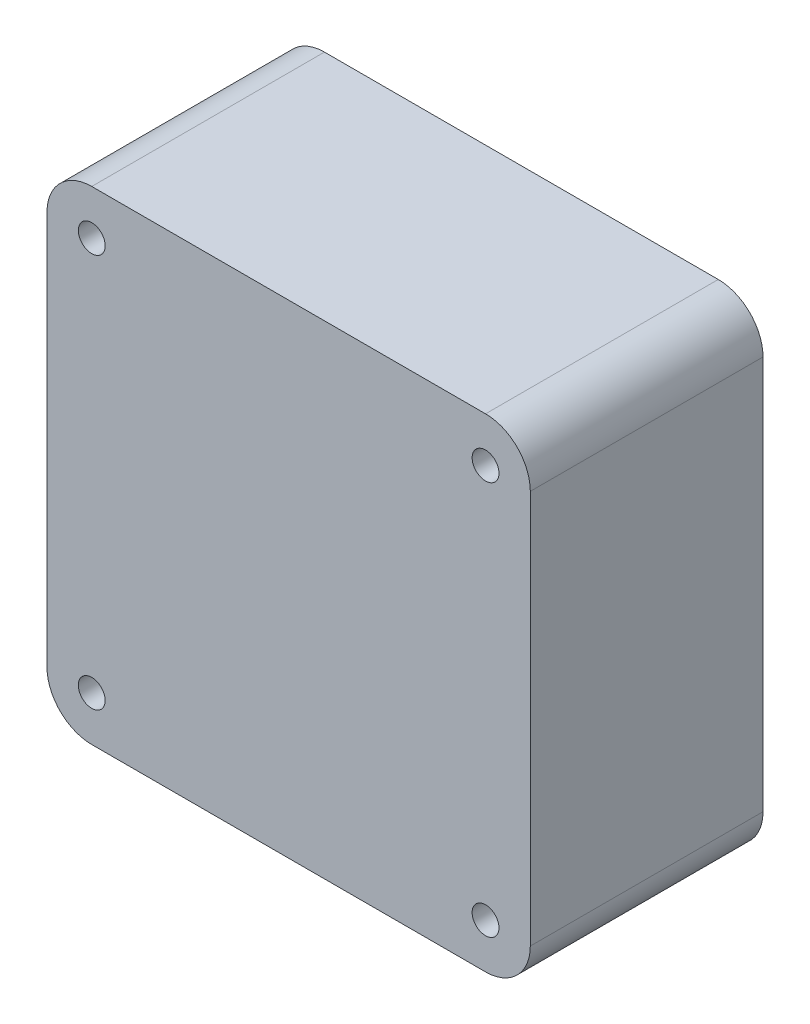
ISO-10303-21;
HEADER;
FILE_DESCRIPTION(('STEP AP214'),'2;1');
FILE_NAME('part.step','',(''),(''),'','','');
FILE_SCHEMA(('AUTOMOTIVE_DESIGN { 1 0 10303 214 1 1 1 1 }'));
ENDSEC;
DATA;
#1=APPLICATION_CONTEXT('core data for automotive mechanical design processes');
#2=APPLICATION_PROTOCOL_DEFINITION('international standard','automotive_design',2000,#1);
#3=PRODUCT_CONTEXT('',#1,'mechanical');
#4=PRODUCT('Part','Part','',(#3));
#5=PRODUCT_RELATED_PRODUCT_CATEGORY('part','',(#4));
#6=PRODUCT_DEFINITION_FORMATION('','',#4);
#7=PRODUCT_DEFINITION_CONTEXT('part definition',#1,'design');
#8=PRODUCT_DEFINITION('design','',#6,#7);
#9=PRODUCT_DEFINITION_SHAPE('','',#8);
#10=(LENGTH_UNIT() NAMED_UNIT(*) SI_UNIT(.MILLI.,.METRE.));
#11=(NAMED_UNIT(*) PLANE_ANGLE_UNIT() SI_UNIT($,.RADIAN.));
#12=(NAMED_UNIT(*) SI_UNIT($,.STERADIAN.) SOLID_ANGLE_UNIT());
#13=UNCERTAINTY_MEASURE_WITH_UNIT(LENGTH_MEASURE(1.E-05),#10,'distance_accuracy_value','');
#14=(GEOMETRIC_REPRESENTATION_CONTEXT(3) GLOBAL_UNCERTAINTY_ASSIGNED_CONTEXT((#13)) GLOBAL_UNIT_ASSIGNED_CONTEXT((#10,
#11,#12)) REPRESENTATION_CONTEXT('',''));
#15=CARTESIAN_POINT('',(0.,0.,0.));
#16=DIRECTION('',(0.,0.,1.));
#17=DIRECTION('',(1.,0.,0.));
#18=AXIS2_PLACEMENT_3D('',#15,#16,#17);
#19=CARTESIAN_POINT('',(-27.,-27.,26.));
#20=DIRECTION('',(1.,0.,0.));
#21=DIRECTION('',(0.,0.,-1.));
#22=AXIS2_PLACEMENT_3D('',#19,#20,#21);
#23=PLANE('',#22);
#24=DIRECTION('',(0.,-1.,0.));
#25=VECTOR('',#24,1.);
#26=CARTESIAN_POINT('',(-27.,-27.,0.));
#27=LINE('',#26,#25);
#28=CARTESIAN_POINT('',(-27.,22.,0.));
#29=VERTEX_POINT('',#28);
#30=CARTESIAN_POINT('',(-27.,-22.,0.));
#31=VERTEX_POINT('',#30);
#32=EDGE_CURVE('E143',#29,#31,#27,.T.);
#33=ORIENTED_EDGE('',*,*,#32,.T.);
#34=DIRECTION('',(0.,0.,-1.));
#35=VECTOR('',#34,1.);
#36=CARTESIAN_POINT('',(-27.,-22.,26.));
#37=LINE('',#36,#35);
#38=CARTESIAN_POINT('',(-27.,-22.,26.));
#39=VERTEX_POINT('',#38);
#40=EDGE_CURVE('E119',#31,#39,#37,.F.);
#41=ORIENTED_EDGE('',*,*,#40,.T.);
#42=DIRECTION('',(0.,-1.,0.));
#43=VECTOR('',#42,1.);
#44=CARTESIAN_POINT('',(-27.,-27.,26.));
#45=LINE('',#44,#43);
#46=CARTESIAN_POINT('',(-27.,22.,26.));
#47=VERTEX_POINT('',#46);
#48=EDGE_CURVE('E152',#47,#39,#45,.T.);
#49=ORIENTED_EDGE('',*,*,#48,.F.);
#50=DIRECTION('',(0.,0.,-1.));
#51=VECTOR('',#50,1.);
#52=CARTESIAN_POINT('',(-27.,22.,26.));
#53=LINE('',#52,#51);
#54=EDGE_CURVE('E124',#47,#29,#53,.T.);
#55=ORIENTED_EDGE('',*,*,#54,.T.);
#56=EDGE_LOOP('',(#33,#41,#49,#55));
#57=FACE_BOUND('',#56,.T.);
#58=ADVANCED_FACE('F42',(#57),#23,.F.);
#59=CARTESIAN_POINT('',(27.,-27.,26.));
#60=DIRECTION('',(0.,1.,0.));
#61=DIRECTION('',(0.,0.,1.));
#62=AXIS2_PLACEMENT_3D('',#59,#60,#61);
#63=PLANE('',#62);
#64=DIRECTION('',(1.,0.,0.));
#65=VECTOR('',#64,1.);
#66=CARTESIAN_POINT('',(27.,-27.,26.));
#67=LINE('',#66,#65);
#68=CARTESIAN_POINT('',(-22.,-27.,26.));
#69=VERTEX_POINT('',#68);
#70=CARTESIAN_POINT('',(22.,-27.,26.));
#71=VERTEX_POINT('',#70);
#72=EDGE_CURVE('E131',#69,#71,#67,.T.);
#73=ORIENTED_EDGE('',*,*,#72,.F.);
#74=DIRECTION('',(0.,0.,-1.));
#75=VECTOR('',#74,1.);
#76=CARTESIAN_POINT('',(-22.,-27.,26.));
#77=LINE('',#76,#75);
#78=CARTESIAN_POINT('',(-22.,-27.,0.));
#79=VERTEX_POINT('',#78);
#80=EDGE_CURVE('E113',#69,#79,#77,.T.);
#81=ORIENTED_EDGE('',*,*,#80,.T.);
#82=DIRECTION('',(1.,0.,0.));
#83=VECTOR('',#82,1.);
#84=CARTESIAN_POINT('',(27.,-27.,0.));
#85=LINE('',#84,#83);
#86=CARTESIAN_POINT('',(22.,-27.,0.));
#87=VERTEX_POINT('',#86);
#88=EDGE_CURVE('E129',#79,#87,#85,.T.);
#89=ORIENTED_EDGE('',*,*,#88,.T.);
#90=DIRECTION('',(0.,0.,-1.));
#91=VECTOR('',#90,1.);
#92=CARTESIAN_POINT('',(22.,-27.,26.));
#93=LINE('',#92,#91);
#94=EDGE_CURVE('E132',#87,#71,#93,.F.);
#95=ORIENTED_EDGE('',*,*,#94,.T.);
#96=EDGE_LOOP('',(#73,#81,#89,#95));
#97=FACE_BOUND('',#96,.T.);
#98=ADVANCED_FACE('F126',(#97),#63,.F.);
#99=CARTESIAN_POINT('',(27.,-27.,26.));
#100=DIRECTION('',(-1.,0.,0.));
#101=DIRECTION('',(0.,0.,1.));
#102=AXIS2_PLACEMENT_3D('',#99,#100,#101);
#103=PLANE('',#102);
#104=DIRECTION('',(0.,1.,0.));
#105=VECTOR('',#104,1.);
#106=CARTESIAN_POINT('',(27.,-27.,26.));
#107=LINE('',#106,#105);
#108=CARTESIAN_POINT('',(27.,-22.,26.));
#109=VERTEX_POINT('',#108);
#110=CARTESIAN_POINT('',(27.,22.,26.));
#111=VERTEX_POINT('',#110);
#112=EDGE_CURVE('E187',#109,#111,#107,.T.);
#113=ORIENTED_EDGE('',*,*,#112,.F.);
#114=DIRECTION('',(0.,0.,-1.));
#115=VECTOR('',#114,1.);
#116=CARTESIAN_POINT('',(27.,-22.,26.));
#117=LINE('',#116,#115);
#118=CARTESIAN_POINT('',(27.,-22.,0.));
#119=VERTEX_POINT('',#118);
#120=EDGE_CURVE('E184',#109,#119,#117,.T.);
#121=ORIENTED_EDGE('',*,*,#120,.T.);
#122=DIRECTION('',(0.,1.,0.));
#123=VECTOR('',#122,1.);
#124=CARTESIAN_POINT('',(27.,-27.,0.));
#125=LINE('',#124,#123);
#126=CARTESIAN_POINT('',(27.,22.,0.));
#127=VERTEX_POINT('',#126);
#128=EDGE_CURVE('E136',#119,#127,#125,.T.);
#129=ORIENTED_EDGE('',*,*,#128,.T.);
#130=DIRECTION('',(0.,0.,-1.));
#131=VECTOR('',#130,1.);
#132=CARTESIAN_POINT('',(27.,22.,26.));
#133=LINE('',#132,#131);
#134=EDGE_CURVE('E182',#127,#111,#133,.F.);
#135=ORIENTED_EDGE('',*,*,#134,.T.);
#136=EDGE_LOOP('',(#113,#121,#129,#135));
#137=FACE_BOUND('',#136,.T.);
#138=ADVANCED_FACE('F263',(#137),#103,.F.);
#139=CARTESIAN_POINT('',(27.,27.,26.));
#140=DIRECTION('',(0.,-1.,0.));
#141=DIRECTION('',(0.,0.,-1.));
#142=AXIS2_PLACEMENT_3D('',#139,#140,#141);
#143=PLANE('',#142);
#144=DIRECTION('',(-1.,0.,0.));
#145=VECTOR('',#144,1.);
#146=CARTESIAN_POINT('',(27.,27.,26.));
#147=LINE('',#146,#145);
#148=CARTESIAN_POINT('',(22.,27.,26.));
#149=VERTEX_POINT('',#148);
#150=CARTESIAN_POINT('',(-22.,27.,26.));
#151=VERTEX_POINT('',#150);
#152=EDGE_CURVE('E156',#149,#151,#147,.T.);
#153=ORIENTED_EDGE('',*,*,#152,.F.);
#154=DIRECTION('',(0.,0.,-1.));
#155=VECTOR('',#154,1.);
#156=CARTESIAN_POINT('',(22.,27.,26.));
#157=LINE('',#156,#155);
#158=CARTESIAN_POINT('',(22.,27.,0.));
#159=VERTEX_POINT('',#158);
#160=EDGE_CURVE('E11',#149,#159,#157,.T.);
#161=ORIENTED_EDGE('',*,*,#160,.T.);
#162=DIRECTION('',(-1.,0.,0.));
#163=VECTOR('',#162,1.);
#164=CARTESIAN_POINT('',(27.,27.,0.));
#165=LINE('',#164,#163);
#166=CARTESIAN_POINT('',(-22.,27.,0.));
#167=VERTEX_POINT('',#166);
#168=EDGE_CURVE('E148',#159,#167,#165,.T.);
#169=ORIENTED_EDGE('',*,*,#168,.T.);
#170=DIRECTION('',(0.,0.,-1.));
#171=VECTOR('',#170,1.);
#172=CARTESIAN_POINT('',(-22.,27.,26.));
#173=LINE('',#172,#171);
#174=EDGE_CURVE('E52',#167,#151,#173,.F.);
#175=ORIENTED_EDGE('',*,*,#174,.T.);
#176=EDGE_LOOP('',(#153,#161,#169,#175));
#177=FACE_BOUND('',#176,.T.);
#178=ADVANCED_FACE('F237',(#177),#143,.F.);
#179=CARTESIAN_POINT('',(0.,0.,26.));
#180=DIRECTION('',(0.,0.,1.));
#181=DIRECTION('',(1.,0.,0.));
#182=AXIS2_PLACEMENT_3D('',#179,#180,#181);
#183=PLANE('',#182);
#184=CARTESIAN_POINT('',(-22.,-22.,26.));
#185=DIRECTION('',(0.,0.,1.));
#186=DIRECTION('',(1.,0.,0.));
#187=AXIS2_PLACEMENT_3D('',#184,#185,#186);
#188=CIRCLE('',#187,1.5);
#189=CARTESIAN_POINT('',(-20.5,-22.,26.));
#190=VERTEX_POINT('',#189);
#191=EDGE_CURVE('E211',#190,#190,#188,.T.);
#192=ORIENTED_EDGE('',*,*,#191,.F.);
#193=EDGE_LOOP('',(#192));
#194=FACE_BOUND('',#193,.T.);
#195=CARTESIAN_POINT('',(22.,-22.,26.));
#196=DIRECTION('',(0.,0.,1.));
#197=DIRECTION('',(1.,0.,0.));
#198=AXIS2_PLACEMENT_3D('',#195,#196,#197);
#199=CIRCLE('',#198,1.5);
#200=CARTESIAN_POINT('',(23.5,-22.,26.));
#201=VERTEX_POINT('',#200);
#202=EDGE_CURVE('E218',#201,#201,#199,.T.);
#203=ORIENTED_EDGE('',*,*,#202,.F.);
#204=EDGE_LOOP('',(#203));
#205=FACE_BOUND('',#204,.T.);
#206=CARTESIAN_POINT('',(22.,22.,26.));
#207=DIRECTION('',(0.,0.,1.));
#208=DIRECTION('',(1.,0.,0.));
#209=AXIS2_PLACEMENT_3D('',#206,#207,#208);
#210=CIRCLE('',#209,1.5);
#211=CARTESIAN_POINT('',(23.5,22.,26.));
#212=VERTEX_POINT('',#211);
#213=EDGE_CURVE('E201',#212,#212,#210,.T.);
#214=ORIENTED_EDGE('',*,*,#213,.F.);
#215=EDGE_LOOP('',(#214));
#216=FACE_BOUND('',#215,.T.);
#217=CARTESIAN_POINT('',(-22.,22.,26.));
#218=DIRECTION('',(0.,0.,1.));
#219=DIRECTION('',(1.,0.,0.));
#220=AXIS2_PLACEMENT_3D('',#217,#218,#219);
#221=CIRCLE('',#220,1.5);
#222=CARTESIAN_POINT('',(-20.5,22.,26.));
#223=VERTEX_POINT('',#222);
#224=EDGE_CURVE('E200',#223,#223,#221,.T.);
#225=ORIENTED_EDGE('',*,*,#224,.F.);
#226=EDGE_LOOP('',(#225));
#227=FACE_BOUND('',#226,.T.);
#228=ORIENTED_EDGE('',*,*,#48,.T.);
#229=CARTESIAN_POINT('',(-22.,-22.,26.));
#230=DIRECTION('',(0.,0.,1.));
#231=DIRECTION('',(1.,0.,0.));
#232=AXIS2_PLACEMENT_3D('',#229,#230,#231);
#233=CIRCLE('',#232,5.);
#234=EDGE_CURVE('E177',#39,#69,#233,.T.);
#235=ORIENTED_EDGE('',*,*,#234,.T.);
#236=ORIENTED_EDGE('',*,*,#72,.T.);
#237=CARTESIAN_POINT('',(22.,-22.,26.));
#238=DIRECTION('',(0.,0.,1.));
#239=DIRECTION('',(1.,0.,0.));
#240=AXIS2_PLACEMENT_3D('',#237,#238,#239);
#241=CIRCLE('',#240,5.);
#242=EDGE_CURVE('E172',#71,#109,#241,.T.);
#243=ORIENTED_EDGE('',*,*,#242,.T.);
#244=ORIENTED_EDGE('',*,*,#112,.T.);
#245=CARTESIAN_POINT('',(22.,22.,26.));
#246=DIRECTION('',(0.,0.,1.));
#247=DIRECTION('',(1.,0.,0.));
#248=AXIS2_PLACEMENT_3D('',#245,#246,#247);
#249=CIRCLE('',#248,5.);
#250=EDGE_CURVE('E68',#111,#149,#249,.T.);
#251=ORIENTED_EDGE('',*,*,#250,.T.);
#252=ORIENTED_EDGE('',*,*,#152,.T.);
#253=CARTESIAN_POINT('',(-22.,22.,26.));
#254=DIRECTION('',(0.,0.,1.));
#255=DIRECTION('',(1.,0.,0.));
#256=AXIS2_PLACEMENT_3D('',#253,#254,#255);
#257=CIRCLE('',#256,5.);
#258=EDGE_CURVE('E168',#151,#47,#257,.T.);
#259=ORIENTED_EDGE('',*,*,#258,.T.);
#260=EDGE_LOOP('',(#228,#235,#236,#243,#244,#251,#252,#259));
#261=FACE_BOUND('',#260,.T.);
#262=ADVANCED_FACE('F232',(#194,#205,#216,#227,#261),#183,.T.);
#263=CARTESIAN_POINT('',(0.,0.,0.));
#264=DIRECTION('',(0.,0.,1.));
#265=DIRECTION('',(1.,0.,0.));
#266=AXIS2_PLACEMENT_3D('',#263,#264,#265);
#267=PLANE('',#266);
#268=CARTESIAN_POINT('',(-22.,-22.,0.));
#269=DIRECTION('',(0.,0.,1.));
#270=DIRECTION('',(1.,0.,0.));
#271=AXIS2_PLACEMENT_3D('',#268,#269,#270);
#272=CIRCLE('',#271,1.5);
#273=CARTESIAN_POINT('',(-20.5,-22.,0.));
#274=VERTEX_POINT('',#273);
#275=EDGE_CURVE('E210',#274,#274,#272,.T.);
#276=ORIENTED_EDGE('',*,*,#275,.T.);
#277=EDGE_LOOP('',(#276));
#278=FACE_BOUND('',#277,.T.);
#279=CARTESIAN_POINT('',(22.,-22.,0.));
#280=DIRECTION('',(0.,0.,1.));
#281=DIRECTION('',(1.,0.,0.));
#282=AXIS2_PLACEMENT_3D('',#279,#280,#281);
#283=CIRCLE('',#282,1.5);
#284=CARTESIAN_POINT('',(23.5,-22.,0.));
#285=VERTEX_POINT('',#284);
#286=EDGE_CURVE('E214',#285,#285,#283,.T.);
#287=ORIENTED_EDGE('',*,*,#286,.T.);
#288=EDGE_LOOP('',(#287));
#289=FACE_BOUND('',#288,.T.);
#290=CARTESIAN_POINT('',(22.,22.,0.));
#291=DIRECTION('',(0.,0.,1.));
#292=DIRECTION('',(1.,0.,0.));
#293=AXIS2_PLACEMENT_3D('',#290,#291,#292);
#294=CIRCLE('',#293,1.5);
#295=CARTESIAN_POINT('',(23.5,22.,0.));
#296=VERTEX_POINT('',#295);
#297=EDGE_CURVE('E224',#296,#296,#294,.T.);
#298=ORIENTED_EDGE('',*,*,#297,.T.);
#299=EDGE_LOOP('',(#298));
#300=FACE_BOUND('',#299,.T.);
#301=CARTESIAN_POINT('',(-22.,22.,0.));
#302=DIRECTION('',(0.,0.,1.));
#303=DIRECTION('',(1.,0.,0.));
#304=AXIS2_PLACEMENT_3D('',#301,#302,#303);
#305=CIRCLE('',#304,1.5);
#306=CARTESIAN_POINT('',(-20.5,22.,0.));
#307=VERTEX_POINT('',#306);
#308=EDGE_CURVE('E146',#307,#307,#305,.T.);
#309=ORIENTED_EDGE('',*,*,#308,.T.);
#310=EDGE_LOOP('',(#309));
#311=FACE_BOUND('',#310,.T.);
#312=ORIENTED_EDGE('',*,*,#88,.F.);
#313=CARTESIAN_POINT('',(-22.,-22.,0.));
#314=DIRECTION('',(0.,0.,1.));
#315=DIRECTION('',(1.,0.,0.));
#316=AXIS2_PLACEMENT_3D('',#313,#314,#315);
#317=CIRCLE('',#316,5.);
#318=EDGE_CURVE('E112',#79,#31,#317,.F.);
#319=ORIENTED_EDGE('',*,*,#318,.T.);
#320=ORIENTED_EDGE('',*,*,#32,.F.);
#321=CARTESIAN_POINT('',(-22.,22.,0.));
#322=DIRECTION('',(0.,0.,1.));
#323=DIRECTION('',(1.,0.,0.));
#324=AXIS2_PLACEMENT_3D('',#321,#322,#323);
#325=CIRCLE('',#324,5.);
#326=EDGE_CURVE('E133',#29,#167,#325,.F.);
#327=ORIENTED_EDGE('',*,*,#326,.T.);
#328=ORIENTED_EDGE('',*,*,#168,.F.);
#329=CARTESIAN_POINT('',(22.,22.,0.));
#330=DIRECTION('',(0.,0.,1.));
#331=DIRECTION('',(1.,0.,0.));
#332=AXIS2_PLACEMENT_3D('',#329,#330,#331);
#333=CIRCLE('',#332,5.);
#334=EDGE_CURVE('E159',#159,#127,#333,.F.);
#335=ORIENTED_EDGE('',*,*,#334,.T.);
#336=ORIENTED_EDGE('',*,*,#128,.F.);
#337=CARTESIAN_POINT('',(22.,-22.,0.));
#338=DIRECTION('',(0.,0.,1.));
#339=DIRECTION('',(1.,0.,0.));
#340=AXIS2_PLACEMENT_3D('',#337,#338,#339);
#341=CIRCLE('',#340,5.);
#342=EDGE_CURVE('E122',#119,#87,#341,.F.);
#343=ORIENTED_EDGE('',*,*,#342,.T.);
#344=EDGE_LOOP('',(#312,#319,#320,#327,#328,#335,#336,#343));
#345=FACE_BOUND('',#344,.T.);
#346=ADVANCED_FACE('F139',(#278,#289,#300,#311,#345),#267,.F.);
#347=CARTESIAN_POINT('',(-22.,-22.,26.));
#348=DIRECTION('',(0.,0.,-1.));
#349=DIRECTION('',(-1.,0.,0.));
#350=AXIS2_PLACEMENT_3D('',#347,#348,#349);
#351=CYLINDRICAL_SURFACE('',#350,5.);
#352=ORIENTED_EDGE('',*,*,#234,.F.);
#353=ORIENTED_EDGE('',*,*,#40,.F.);
#354=ORIENTED_EDGE('',*,*,#318,.F.);
#355=ORIENTED_EDGE('',*,*,#80,.F.);
#356=EDGE_LOOP('',(#352,#353,#354,#355));
#357=FACE_BOUND('',#356,.T.);
#358=ADVANCED_FACE('F111',(#357),#351,.T.);
#359=CARTESIAN_POINT('',(22.,-22.,26.));
#360=DIRECTION('',(0.,0.,-1.));
#361=DIRECTION('',(-1.,0.,0.));
#362=AXIS2_PLACEMENT_3D('',#359,#360,#361);
#363=CYLINDRICAL_SURFACE('',#362,5.);
#364=ORIENTED_EDGE('',*,*,#242,.F.);
#365=ORIENTED_EDGE('',*,*,#94,.F.);
#366=ORIENTED_EDGE('',*,*,#342,.F.);
#367=ORIENTED_EDGE('',*,*,#120,.F.);
#368=EDGE_LOOP('',(#364,#365,#366,#367));
#369=FACE_BOUND('',#368,.T.);
#370=ADVANCED_FACE('F267',(#369),#363,.T.);
#371=CARTESIAN_POINT('',(22.,22.,26.));
#372=DIRECTION('',(0.,0.,-1.));
#373=DIRECTION('',(-1.,0.,0.));
#374=AXIS2_PLACEMENT_3D('',#371,#372,#373);
#375=CYLINDRICAL_SURFACE('',#374,5.);
#376=ORIENTED_EDGE('',*,*,#250,.F.);
#377=ORIENTED_EDGE('',*,*,#134,.F.);
#378=ORIENTED_EDGE('',*,*,#334,.F.);
#379=ORIENTED_EDGE('',*,*,#160,.F.);
#380=EDGE_LOOP('',(#376,#377,#378,#379));
#381=FACE_BOUND('',#380,.T.);
#382=ADVANCED_FACE('F251',(#381),#375,.T.);
#383=CARTESIAN_POINT('',(-22.,22.,26.));
#384=DIRECTION('',(0.,0.,-1.));
#385=DIRECTION('',(-1.,0.,0.));
#386=AXIS2_PLACEMENT_3D('',#383,#384,#385);
#387=CYLINDRICAL_SURFACE('',#386,5.);
#388=ORIENTED_EDGE('',*,*,#258,.F.);
#389=ORIENTED_EDGE('',*,*,#174,.F.);
#390=ORIENTED_EDGE('',*,*,#326,.F.);
#391=ORIENTED_EDGE('',*,*,#54,.F.);
#392=EDGE_LOOP('',(#388,#389,#390,#391));
#393=FACE_BOUND('',#392,.T.);
#394=ADVANCED_FACE('F46',(#393),#387,.T.);
#395=CARTESIAN_POINT('',(-22.,22.,0.));
#396=DIRECTION('',(0.,0.,1.));
#397=DIRECTION('',(1.,0.,0.));
#398=AXIS2_PLACEMENT_3D('',#395,#396,#397);
#399=CYLINDRICAL_SURFACE('',#398,1.5);
#400=CARTESIAN_POINT('',(-20.5,22.,0.));
#401=CARTESIAN_POINT('',(-20.5,22.,0.270833333333333));
#402=CARTESIAN_POINT('',(-20.5,22.,0.541666666666667));
#403=CARTESIAN_POINT('',(-20.5,22.,1.08333333333333));
#404=CARTESIAN_POINT('',(-20.5,22.,1.35416666666667));
#405=CARTESIAN_POINT('',(-20.5,22.,1.89583333333333));
#406=CARTESIAN_POINT('',(-20.5,22.,2.16666666666667));
#407=CARTESIAN_POINT('',(-20.5,22.,2.70833333333333));
#408=CARTESIAN_POINT('',(-20.5,22.,2.97916666666667));
#409=CARTESIAN_POINT('',(-20.5,22.,3.52083333333333));
#410=CARTESIAN_POINT('',(-20.5,22.,3.79166666666667));
#411=CARTESIAN_POINT('',(-20.5,22.,4.33333333333333));
#412=CARTESIAN_POINT('',(-20.5,22.,4.60416666666667));
#413=CARTESIAN_POINT('',(-20.5,22.,5.14583333333333));
#414=CARTESIAN_POINT('',(-20.5,22.,5.41666666666667));
#415=CARTESIAN_POINT('',(-20.5,22.,5.95833333333333));
#416=CARTESIAN_POINT('',(-20.5,22.,6.22916666666667));
#417=CARTESIAN_POINT('',(-20.5,22.,6.77083333333333));
#418=CARTESIAN_POINT('',(-20.5,22.,7.04166666666667));
#419=CARTESIAN_POINT('',(-20.5,22.,7.58333333333333));
#420=CARTESIAN_POINT('',(-20.5,22.,7.85416666666667));
#421=CARTESIAN_POINT('',(-20.5,22.,8.39583333333333));
#422=CARTESIAN_POINT('',(-20.5,22.,8.66666666666667));
#423=CARTESIAN_POINT('',(-20.5,22.,9.20833333333333));
#424=CARTESIAN_POINT('',(-20.5,22.,9.47916666666667));
#425=CARTESIAN_POINT('',(-20.5,22.,10.0208333333333));
#426=CARTESIAN_POINT('',(-20.5,22.,10.2916666666667));
#427=CARTESIAN_POINT('',(-20.5,22.,10.8333333333333));
#428=CARTESIAN_POINT('',(-20.5,22.,11.1041666666667));
#429=CARTESIAN_POINT('',(-20.5,22.,11.6458333333333));
#430=CARTESIAN_POINT('',(-20.5,22.,11.9166666666667));
#431=CARTESIAN_POINT('',(-20.5,22.,12.4583333333333));
#432=CARTESIAN_POINT('',(-20.5,22.,12.7291666666667));
#433=CARTESIAN_POINT('',(-20.5,22.,13.2708333333333));
#434=CARTESIAN_POINT('',(-20.5,22.,13.5416666666667));
#435=CARTESIAN_POINT('',(-20.5,22.,14.0833333333333));
#436=CARTESIAN_POINT('',(-20.5,22.,14.3541666666667));
#437=CARTESIAN_POINT('',(-20.5,22.,14.8958333333333));
#438=CARTESIAN_POINT('',(-20.5,22.,15.1666666666667));
#439=CARTESIAN_POINT('',(-20.5,22.,15.7083333333333));
#440=CARTESIAN_POINT('',(-20.5,22.,15.9791666666667));
#441=CARTESIAN_POINT('',(-20.5,22.,16.5208333333333));
#442=CARTESIAN_POINT('',(-20.5,22.,16.7916666666667));
#443=CARTESIAN_POINT('',(-20.5,22.,17.3333333333333));
#444=CARTESIAN_POINT('',(-20.5,22.,17.6041666666667));
#445=CARTESIAN_POINT('',(-20.5,22.,18.1458333333333));
#446=CARTESIAN_POINT('',(-20.5,22.,18.4166666666667));
#447=CARTESIAN_POINT('',(-20.5,22.,18.9583333333333));
#448=CARTESIAN_POINT('',(-20.5,22.,19.2291666666667));
#449=CARTESIAN_POINT('',(-20.5,22.,19.7708333333333));
#450=CARTESIAN_POINT('',(-20.5,22.,20.0416666666667));
#451=CARTESIAN_POINT('',(-20.5,22.,20.5833333333333));
#452=CARTESIAN_POINT('',(-20.5,22.,20.8541666666667));
#453=CARTESIAN_POINT('',(-20.5,22.,21.3958333333333));
#454=CARTESIAN_POINT('',(-20.5,22.,21.6666666666667));
#455=CARTESIAN_POINT('',(-20.5,22.,22.2083333333333));
#456=CARTESIAN_POINT('',(-20.5,22.,22.4791666666667));
#457=CARTESIAN_POINT('',(-20.5,22.,23.0208333333333));
#458=CARTESIAN_POINT('',(-20.5,22.,23.2916666666667));
#459=CARTESIAN_POINT('',(-20.5,22.,23.8333333333333));
#460=CARTESIAN_POINT('',(-20.5,22.,24.1041666666667));
#461=CARTESIAN_POINT('',(-20.5,22.,24.6458333333333));
#462=CARTESIAN_POINT('',(-20.5,22.,24.9166666666667));
#463=CARTESIAN_POINT('',(-20.5,22.,25.4583333333333));
#464=CARTESIAN_POINT('',(-20.5,22.,25.7291666666667));
#465=CARTESIAN_POINT('',(-20.5,22.,26.));
#466=B_SPLINE_CURVE_WITH_KNOTS('',3,(#400,#401,#402,#403,#404,#405,#406,#407,#408,#409,#410,
#411,#412,#413,#414,#415,#416,#417,#418,#419,#420,#421,#422,#423,#424,#425,#426,#427,#428,#429,
#430,#431,#432,#433,#434,#435,#436,#437,#438,#439,#440,#441,#442,#443,#444,#445,#446,#447,#448,
#449,#450,#451,#452,#453,#454,#455,#456,#457,#458,#459,#460,#461,#462,#463,#464,#465),
.UNSPECIFIED.,.F.,.F.,(4,2,2,2,2,2,2,2,2,2,2,2,2,2,2,2,2,2,2,2,2,2,2,2,2,2,2,2,2,2,2,2,4),(0.,
0.8125,1.625,2.4375,3.25,4.0625,4.875,5.6875,6.5,7.3125,8.125,8.9375,9.75,10.5625,11.375,
12.1875,13.,13.8125,14.625,15.4375,16.25,17.0625,17.875,18.6875,19.5,20.3125,21.125,21.9375,
22.75,23.5625,24.375,25.1875,26.),.UNSPECIFIED.);
#467=EDGE_CURVE('BSEAM244',#307,#223,#466,.T.);
#468=ORIENTED_EDGE('',*,*,#308,.F.);
#469=ORIENTED_EDGE('',*,*,#224,.T.);
#470=ORIENTED_EDGE('',*,*,#467,.T.);
#471=ORIENTED_EDGE('',*,*,#467,.F.);
#472=EDGE_LOOP('',(#468,#470,#469,#471));
#473=FACE_BOUND('',#472,.T.);
#474=ADVANCED_FACE('F244',(#473),#399,.F.);
#475=CARTESIAN_POINT('',(22.,22.,0.));
#476=DIRECTION('',(0.,0.,1.));
#477=DIRECTION('',(1.,0.,0.));
#478=AXIS2_PLACEMENT_3D('',#475,#476,#477);
#479=CYLINDRICAL_SURFACE('',#478,1.5);
#480=CARTESIAN_POINT('',(23.5,22.,0.));
#481=CARTESIAN_POINT('',(23.5,22.,0.270833333333333));
#482=CARTESIAN_POINT('',(23.5,22.,0.541666666666667));
#483=CARTESIAN_POINT('',(23.5,22.,1.08333333333333));
#484=CARTESIAN_POINT('',(23.5,22.,1.35416666666667));
#485=CARTESIAN_POINT('',(23.5,22.,1.89583333333333));
#486=CARTESIAN_POINT('',(23.5,22.,2.16666666666667));
#487=CARTESIAN_POINT('',(23.5,22.,2.70833333333333));
#488=CARTESIAN_POINT('',(23.5,22.,2.97916666666667));
#489=CARTESIAN_POINT('',(23.5,22.,3.52083333333333));
#490=CARTESIAN_POINT('',(23.5,22.,3.79166666666667));
#491=CARTESIAN_POINT('',(23.5,22.,4.33333333333333));
#492=CARTESIAN_POINT('',(23.5,22.,4.60416666666667));
#493=CARTESIAN_POINT('',(23.5,22.,5.14583333333333));
#494=CARTESIAN_POINT('',(23.5,22.,5.41666666666667));
#495=CARTESIAN_POINT('',(23.5,22.,5.95833333333333));
#496=CARTESIAN_POINT('',(23.5,22.,6.22916666666667));
#497=CARTESIAN_POINT('',(23.5,22.,6.77083333333333));
#498=CARTESIAN_POINT('',(23.5,22.,7.04166666666667));
#499=CARTESIAN_POINT('',(23.5,22.,7.58333333333333));
#500=CARTESIAN_POINT('',(23.5,22.,7.85416666666667));
#501=CARTESIAN_POINT('',(23.5,22.,8.39583333333333));
#502=CARTESIAN_POINT('',(23.5,22.,8.66666666666667));
#503=CARTESIAN_POINT('',(23.5,22.,9.20833333333333));
#504=CARTESIAN_POINT('',(23.5,22.,9.47916666666667));
#505=CARTESIAN_POINT('',(23.5,22.,10.0208333333333));
#506=CARTESIAN_POINT('',(23.5,22.,10.2916666666667));
#507=CARTESIAN_POINT('',(23.5,22.,10.8333333333333));
#508=CARTESIAN_POINT('',(23.5,22.,11.1041666666667));
#509=CARTESIAN_POINT('',(23.5,22.,11.6458333333333));
#510=CARTESIAN_POINT('',(23.5,22.,11.9166666666667));
#511=CARTESIAN_POINT('',(23.5,22.,12.4583333333333));
#512=CARTESIAN_POINT('',(23.5,22.,12.7291666666667));
#513=CARTESIAN_POINT('',(23.5,22.,13.2708333333333));
#514=CARTESIAN_POINT('',(23.5,22.,13.5416666666667));
#515=CARTESIAN_POINT('',(23.5,22.,14.0833333333333));
#516=CARTESIAN_POINT('',(23.5,22.,14.3541666666667));
#517=CARTESIAN_POINT('',(23.5,22.,14.8958333333333));
#518=CARTESIAN_POINT('',(23.5,22.,15.1666666666667));
#519=CARTESIAN_POINT('',(23.5,22.,15.7083333333333));
#520=CARTESIAN_POINT('',(23.5,22.,15.9791666666667));
#521=CARTESIAN_POINT('',(23.5,22.,16.5208333333333));
#522=CARTESIAN_POINT('',(23.5,22.,16.7916666666667));
#523=CARTESIAN_POINT('',(23.5,22.,17.3333333333333));
#524=CARTESIAN_POINT('',(23.5,22.,17.6041666666667));
#525=CARTESIAN_POINT('',(23.5,22.,18.1458333333333));
#526=CARTESIAN_POINT('',(23.5,22.,18.4166666666667));
#527=CARTESIAN_POINT('',(23.5,22.,18.9583333333333));
#528=CARTESIAN_POINT('',(23.5,22.,19.2291666666667));
#529=CARTESIAN_POINT('',(23.5,22.,19.7708333333333));
#530=CARTESIAN_POINT('',(23.5,22.,20.0416666666667));
#531=CARTESIAN_POINT('',(23.5,22.,20.5833333333333));
#532=CARTESIAN_POINT('',(23.5,22.,20.8541666666667));
#533=CARTESIAN_POINT('',(23.5,22.,21.3958333333333));
#534=CARTESIAN_POINT('',(23.5,22.,21.6666666666667));
#535=CARTESIAN_POINT('',(23.5,22.,22.2083333333333));
#536=CARTESIAN_POINT('',(23.5,22.,22.4791666666667));
#537=CARTESIAN_POINT('',(23.5,22.,23.0208333333333));
#538=CARTESIAN_POINT('',(23.5,22.,23.2916666666667));
#539=CARTESIAN_POINT('',(23.5,22.,23.8333333333333));
#540=CARTESIAN_POINT('',(23.5,22.,24.1041666666667));
#541=CARTESIAN_POINT('',(23.5,22.,24.6458333333333));
#542=CARTESIAN_POINT('',(23.5,22.,24.9166666666667));
#543=CARTESIAN_POINT('',(23.5,22.,25.4583333333333));
#544=CARTESIAN_POINT('',(23.5,22.,25.7291666666667));
#545=CARTESIAN_POINT('',(23.5,22.,26.));
#546=B_SPLINE_CURVE_WITH_KNOTS('',3,(#480,#481,#482,#483,#484,#485,#486,#487,#488,#489,#490,
#491,#492,#493,#494,#495,#496,#497,#498,#499,#500,#501,#502,#503,#504,#505,#506,#507,#508,#509,
#510,#511,#512,#513,#514,#515,#516,#517,#518,#519,#520,#521,#522,#523,#524,#525,#526,#527,#528,
#529,#530,#531,#532,#533,#534,#535,#536,#537,#538,#539,#540,#541,#542,#543,#544,#545),
.UNSPECIFIED.,.F.,.F.,(4,2,2,2,2,2,2,2,2,2,2,2,2,2,2,2,2,2,2,2,2,2,2,2,2,2,2,2,2,2,2,2,4),(0.,
0.8125,1.625,2.4375,3.25,4.0625,4.875,5.6875,6.5,7.3125,8.125,8.9375,9.75,10.5625,11.375,
12.1875,13.,13.8125,14.625,15.4375,16.25,17.0625,17.875,18.6875,19.5,20.3125,21.125,21.9375,
22.75,23.5625,24.375,25.1875,26.),.UNSPECIFIED.);
#547=EDGE_CURVE('BSEAM233',#296,#212,#546,.T.);
#548=ORIENTED_EDGE('',*,*,#297,.F.);
#549=ORIENTED_EDGE('',*,*,#213,.T.);
#550=ORIENTED_EDGE('',*,*,#547,.T.);
#551=ORIENTED_EDGE('',*,*,#547,.F.);
#552=EDGE_LOOP('',(#548,#550,#549,#551));
#553=FACE_BOUND('',#552,.T.);
#554=ADVANCED_FACE('F233',(#553),#479,.F.);
#555=CARTESIAN_POINT('',(22.,-22.,0.));
#556=DIRECTION('',(0.,0.,1.));
#557=DIRECTION('',(1.,0.,0.));
#558=AXIS2_PLACEMENT_3D('',#555,#556,#557);
#559=CYLINDRICAL_SURFACE('',#558,1.5);
#560=CARTESIAN_POINT('',(23.5,-22.,0.));
#561=CARTESIAN_POINT('',(23.5,-22.,0.270833333333333));
#562=CARTESIAN_POINT('',(23.5,-22.,0.541666666666667));
#563=CARTESIAN_POINT('',(23.5,-22.,1.08333333333333));
#564=CARTESIAN_POINT('',(23.5,-22.,1.35416666666667));
#565=CARTESIAN_POINT('',(23.5,-22.,1.89583333333333));
#566=CARTESIAN_POINT('',(23.5,-22.,2.16666666666667));
#567=CARTESIAN_POINT('',(23.5,-22.,2.70833333333333));
#568=CARTESIAN_POINT('',(23.5,-22.,2.97916666666667));
#569=CARTESIAN_POINT('',(23.5,-22.,3.52083333333333));
#570=CARTESIAN_POINT('',(23.5,-22.,3.79166666666667));
#571=CARTESIAN_POINT('',(23.5,-22.,4.33333333333333));
#572=CARTESIAN_POINT('',(23.5,-22.,4.60416666666667));
#573=CARTESIAN_POINT('',(23.5,-22.,5.14583333333333));
#574=CARTESIAN_POINT('',(23.5,-22.,5.41666666666667));
#575=CARTESIAN_POINT('',(23.5,-22.,5.95833333333333));
#576=CARTESIAN_POINT('',(23.5,-22.,6.22916666666667));
#577=CARTESIAN_POINT('',(23.5,-22.,6.77083333333333));
#578=CARTESIAN_POINT('',(23.5,-22.,7.04166666666667));
#579=CARTESIAN_POINT('',(23.5,-22.,7.58333333333333));
#580=CARTESIAN_POINT('',(23.5,-22.,7.85416666666667));
#581=CARTESIAN_POINT('',(23.5,-22.,8.39583333333333));
#582=CARTESIAN_POINT('',(23.5,-22.,8.66666666666667));
#583=CARTESIAN_POINT('',(23.5,-22.,9.20833333333333));
#584=CARTESIAN_POINT('',(23.5,-22.,9.47916666666667));
#585=CARTESIAN_POINT('',(23.5,-22.,10.0208333333333));
#586=CARTESIAN_POINT('',(23.5,-22.,10.2916666666667));
#587=CARTESIAN_POINT('',(23.5,-22.,10.8333333333333));
#588=CARTESIAN_POINT('',(23.5,-22.,11.1041666666667));
#589=CARTESIAN_POINT('',(23.5,-22.,11.6458333333333));
#590=CARTESIAN_POINT('',(23.5,-22.,11.9166666666667));
#591=CARTESIAN_POINT('',(23.5,-22.,12.4583333333333));
#592=CARTESIAN_POINT('',(23.5,-22.,12.7291666666667));
#593=CARTESIAN_POINT('',(23.5,-22.,13.2708333333333));
#594=CARTESIAN_POINT('',(23.5,-22.,13.5416666666667));
#595=CARTESIAN_POINT('',(23.5,-22.,14.0833333333333));
#596=CARTESIAN_POINT('',(23.5,-22.,14.3541666666667));
#597=CARTESIAN_POINT('',(23.5,-22.,14.8958333333333));
#598=CARTESIAN_POINT('',(23.5,-22.,15.1666666666667));
#599=CARTESIAN_POINT('',(23.5,-22.,15.7083333333333));
#600=CARTESIAN_POINT('',(23.5,-22.,15.9791666666667));
#601=CARTESIAN_POINT('',(23.5,-22.,16.5208333333333));
#602=CARTESIAN_POINT('',(23.5,-22.,16.7916666666667));
#603=CARTESIAN_POINT('',(23.5,-22.,17.3333333333333));
#604=CARTESIAN_POINT('',(23.5,-22.,17.6041666666667));
#605=CARTESIAN_POINT('',(23.5,-22.,18.1458333333333));
#606=CARTESIAN_POINT('',(23.5,-22.,18.4166666666667));
#607=CARTESIAN_POINT('',(23.5,-22.,18.9583333333333));
#608=CARTESIAN_POINT('',(23.5,-22.,19.2291666666667));
#609=CARTESIAN_POINT('',(23.5,-22.,19.7708333333333));
#610=CARTESIAN_POINT('',(23.5,-22.,20.0416666666667));
#611=CARTESIAN_POINT('',(23.5,-22.,20.5833333333333));
#612=CARTESIAN_POINT('',(23.5,-22.,20.8541666666667));
#613=CARTESIAN_POINT('',(23.5,-22.,21.3958333333333));
#614=CARTESIAN_POINT('',(23.5,-22.,21.6666666666667));
#615=CARTESIAN_POINT('',(23.5,-22.,22.2083333333333));
#616=CARTESIAN_POINT('',(23.5,-22.,22.4791666666667));
#617=CARTESIAN_POINT('',(23.5,-22.,23.0208333333333));
#618=CARTESIAN_POINT('',(23.5,-22.,23.2916666666667));
#619=CARTESIAN_POINT('',(23.5,-22.,23.8333333333333));
#620=CARTESIAN_POINT('',(23.5,-22.,24.1041666666667));
#621=CARTESIAN_POINT('',(23.5,-22.,24.6458333333333));
#622=CARTESIAN_POINT('',(23.5,-22.,24.9166666666667));
#623=CARTESIAN_POINT('',(23.5,-22.,25.4583333333333));
#624=CARTESIAN_POINT('',(23.5,-22.,25.7291666666667));
#625=CARTESIAN_POINT('',(23.5,-22.,26.));
#626=B_SPLINE_CURVE_WITH_KNOTS('',3,(#560,#561,#562,#563,#564,#565,#566,#567,#568,#569,#570,
#571,#572,#573,#574,#575,#576,#577,#578,#579,#580,#581,#582,#583,#584,#585,#586,#587,#588,#589,
#590,#591,#592,#593,#594,#595,#596,#597,#598,#599,#600,#601,#602,#603,#604,#605,#606,#607,#608,
#609,#610,#611,#612,#613,#614,#615,#616,#617,#618,#619,#620,#621,#622,#623,#624,#625),
.UNSPECIFIED.,.F.,.F.,(4,2,2,2,2,2,2,2,2,2,2,2,2,2,2,2,2,2,2,2,2,2,2,2,2,2,2,2,2,2,2,2,4),(0.,
0.8125,1.625,2.4375,3.25,4.0625,4.875,5.6875,6.5,7.3125,8.125,8.9375,9.75,10.5625,11.375,
12.1875,13.,13.8125,14.625,15.4375,16.25,17.0625,17.875,18.6875,19.5,20.3125,21.125,21.9375,
22.75,23.5625,24.375,25.1875,26.),.UNSPECIFIED.);
#627=EDGE_CURVE('BSEAM250',#285,#201,#626,.T.);
#628=ORIENTED_EDGE('',*,*,#286,.F.);
#629=ORIENTED_EDGE('',*,*,#202,.T.);
#630=ORIENTED_EDGE('',*,*,#627,.T.);
#631=ORIENTED_EDGE('',*,*,#627,.F.);
#632=EDGE_LOOP('',(#628,#630,#629,#631));
#633=FACE_BOUND('',#632,.T.);
#634=ADVANCED_FACE('F250',(#633),#559,.F.);
#635=CARTESIAN_POINT('',(-22.,-22.,0.));
#636=DIRECTION('',(0.,0.,1.));
#637=DIRECTION('',(1.,0.,0.));
#638=AXIS2_PLACEMENT_3D('',#635,#636,#637);
#639=CYLINDRICAL_SURFACE('',#638,1.5);
#640=CARTESIAN_POINT('',(-20.5,-22.,0.));
#641=CARTESIAN_POINT('',(-20.5,-22.,0.270833333333333));
#642=CARTESIAN_POINT('',(-20.5,-22.,0.541666666666667));
#643=CARTESIAN_POINT('',(-20.5,-22.,1.08333333333333));
#644=CARTESIAN_POINT('',(-20.5,-22.,1.35416666666667));
#645=CARTESIAN_POINT('',(-20.5,-22.,1.89583333333333));
#646=CARTESIAN_POINT('',(-20.5,-22.,2.16666666666667));
#647=CARTESIAN_POINT('',(-20.5,-22.,2.70833333333333));
#648=CARTESIAN_POINT('',(-20.5,-22.,2.97916666666667));
#649=CARTESIAN_POINT('',(-20.5,-22.,3.52083333333333));
#650=CARTESIAN_POINT('',(-20.5,-22.,3.79166666666667));
#651=CARTESIAN_POINT('',(-20.5,-22.,4.33333333333333));
#652=CARTESIAN_POINT('',(-20.5,-22.,4.60416666666667));
#653=CARTESIAN_POINT('',(-20.5,-22.,5.14583333333333));
#654=CARTESIAN_POINT('',(-20.5,-22.,5.41666666666667));
#655=CARTESIAN_POINT('',(-20.5,-22.,5.95833333333333));
#656=CARTESIAN_POINT('',(-20.5,-22.,6.22916666666667));
#657=CARTESIAN_POINT('',(-20.5,-22.,6.77083333333333));
#658=CARTESIAN_POINT('',(-20.5,-22.,7.04166666666667));
#659=CARTESIAN_POINT('',(-20.5,-22.,7.58333333333333));
#660=CARTESIAN_POINT('',(-20.5,-22.,7.85416666666667));
#661=CARTESIAN_POINT('',(-20.5,-22.,8.39583333333333));
#662=CARTESIAN_POINT('',(-20.5,-22.,8.66666666666667));
#663=CARTESIAN_POINT('',(-20.5,-22.,9.20833333333333));
#664=CARTESIAN_POINT('',(-20.5,-22.,9.47916666666667));
#665=CARTESIAN_POINT('',(-20.5,-22.,10.0208333333333));
#666=CARTESIAN_POINT('',(-20.5,-22.,10.2916666666667));
#667=CARTESIAN_POINT('',(-20.5,-22.,10.8333333333333));
#668=CARTESIAN_POINT('',(-20.5,-22.,11.1041666666667));
#669=CARTESIAN_POINT('',(-20.5,-22.,11.6458333333333));
#670=CARTESIAN_POINT('',(-20.5,-22.,11.9166666666667));
#671=CARTESIAN_POINT('',(-20.5,-22.,12.4583333333333));
#672=CARTESIAN_POINT('',(-20.5,-22.,12.7291666666667));
#673=CARTESIAN_POINT('',(-20.5,-22.,13.2708333333333));
#674=CARTESIAN_POINT('',(-20.5,-22.,13.5416666666667));
#675=CARTESIAN_POINT('',(-20.5,-22.,14.0833333333333));
#676=CARTESIAN_POINT('',(-20.5,-22.,14.3541666666667));
#677=CARTESIAN_POINT('',(-20.5,-22.,14.8958333333333));
#678=CARTESIAN_POINT('',(-20.5,-22.,15.1666666666667));
#679=CARTESIAN_POINT('',(-20.5,-22.,15.7083333333333));
#680=CARTESIAN_POINT('',(-20.5,-22.,15.9791666666667));
#681=CARTESIAN_POINT('',(-20.5,-22.,16.5208333333333));
#682=CARTESIAN_POINT('',(-20.5,-22.,16.7916666666667));
#683=CARTESIAN_POINT('',(-20.5,-22.,17.3333333333333));
#684=CARTESIAN_POINT('',(-20.5,-22.,17.6041666666667));
#685=CARTESIAN_POINT('',(-20.5,-22.,18.1458333333333));
#686=CARTESIAN_POINT('',(-20.5,-22.,18.4166666666667));
#687=CARTESIAN_POINT('',(-20.5,-22.,18.9583333333333));
#688=CARTESIAN_POINT('',(-20.5,-22.,19.2291666666667));
#689=CARTESIAN_POINT('',(-20.5,-22.,19.7708333333333));
#690=CARTESIAN_POINT('',(-20.5,-22.,20.0416666666667));
#691=CARTESIAN_POINT('',(-20.5,-22.,20.5833333333333));
#692=CARTESIAN_POINT('',(-20.5,-22.,20.8541666666667));
#693=CARTESIAN_POINT('',(-20.5,-22.,21.3958333333333));
#694=CARTESIAN_POINT('',(-20.5,-22.,21.6666666666667));
#695=CARTESIAN_POINT('',(-20.5,-22.,22.2083333333333));
#696=CARTESIAN_POINT('',(-20.5,-22.,22.4791666666667));
#697=CARTESIAN_POINT('',(-20.5,-22.,23.0208333333333));
#698=CARTESIAN_POINT('',(-20.5,-22.,23.2916666666667));
#699=CARTESIAN_POINT('',(-20.5,-22.,23.8333333333333));
#700=CARTESIAN_POINT('',(-20.5,-22.,24.1041666666667));
#701=CARTESIAN_POINT('',(-20.5,-22.,24.6458333333333));
#702=CARTESIAN_POINT('',(-20.5,-22.,24.9166666666667));
#703=CARTESIAN_POINT('',(-20.5,-22.,25.4583333333333));
#704=CARTESIAN_POINT('',(-20.5,-22.,25.7291666666667));
#705=CARTESIAN_POINT('',(-20.5,-22.,26.));
#706=B_SPLINE_CURVE_WITH_KNOTS('',3,(#640,#641,#642,#643,#644,#645,#646,#647,#648,#649,#650,
#651,#652,#653,#654,#655,#656,#657,#658,#659,#660,#661,#662,#663,#664,#665,#666,#667,#668,#669,
#670,#671,#672,#673,#674,#675,#676,#677,#678,#679,#680,#681,#682,#683,#684,#685,#686,#687,#688,
#689,#690,#691,#692,#693,#694,#695,#696,#697,#698,#699,#700,#701,#702,#703,#704,#705),
.UNSPECIFIED.,.F.,.F.,(4,2,2,2,2,2,2,2,2,2,2,2,2,2,2,2,2,2,2,2,2,2,2,2,2,2,2,2,2,2,2,2,4),(0.,
0.8125,1.625,2.4375,3.25,4.0625,4.875,5.6875,6.5,7.3125,8.125,8.9375,9.75,10.5625,11.375,
12.1875,13.,13.8125,14.625,15.4375,16.25,17.0625,17.875,18.6875,19.5,20.3125,21.125,21.9375,
22.75,23.5625,24.375,25.1875,26.),.UNSPECIFIED.);
#707=EDGE_CURVE('BSEAM302',#274,#190,#706,.T.);
#708=ORIENTED_EDGE('',*,*,#275,.F.);
#709=ORIENTED_EDGE('',*,*,#191,.T.);
#710=ORIENTED_EDGE('',*,*,#707,.T.);
#711=ORIENTED_EDGE('',*,*,#707,.F.);
#712=EDGE_LOOP('',(#708,#710,#709,#711));
#713=FACE_BOUND('',#712,.T.);
#714=ADVANCED_FACE('F302',(#713),#639,.F.);
#715=CLOSED_SHELL('',(#58,#98,#138,#178,#262,#346,#358,#370,#382,#394,#474,#554,#634,#714));
#716=MANIFOLD_SOLID_BREP('B2',#715);
#717=ADVANCED_BREP_SHAPE_REPRESENTATION('',(#18,#716),#14);
#718=SHAPE_DEFINITION_REPRESENTATION(#9,#717);
ENDSEC;
END-ISO-10303-21;
